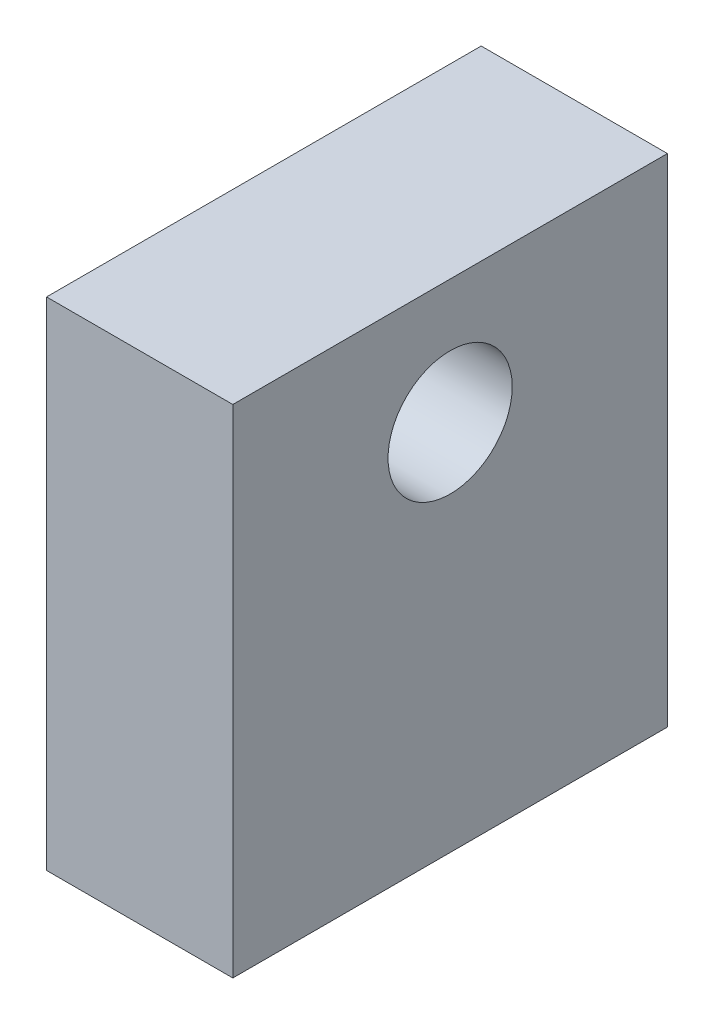
ISO-10303-21;
HEADER;
FILE_DESCRIPTION(('STEP AP214'),'2;1');
FILE_NAME('part.step','',(''),(''),'','','');
FILE_SCHEMA(('AUTOMOTIVE_DESIGN { 1 0 10303 214 1 1 1 1 }'));
ENDSEC;
DATA;
#1=APPLICATION_CONTEXT('core data for automotive mechanical design processes');
#2=APPLICATION_PROTOCOL_DEFINITION('international standard','automotive_design',2000,#1);
#3=PRODUCT_CONTEXT('',#1,'mechanical');
#4=PRODUCT('Part','Part','',(#3));
#5=PRODUCT_RELATED_PRODUCT_CATEGORY('part','',(#4));
#6=PRODUCT_DEFINITION_FORMATION('','',#4);
#7=PRODUCT_DEFINITION_CONTEXT('part definition',#1,'design');
#8=PRODUCT_DEFINITION('design','',#6,#7);
#9=PRODUCT_DEFINITION_SHAPE('','',#8);
#10=(LENGTH_UNIT() NAMED_UNIT(*) SI_UNIT(.MILLI.,.METRE.));
#11=(NAMED_UNIT(*) PLANE_ANGLE_UNIT() SI_UNIT($,.RADIAN.));
#12=(NAMED_UNIT(*) SI_UNIT($,.STERADIAN.) SOLID_ANGLE_UNIT());
#13=UNCERTAINTY_MEASURE_WITH_UNIT(LENGTH_MEASURE(1.E-05),#10,'distance_accuracy_value','');
#14=(GEOMETRIC_REPRESENTATION_CONTEXT(3) GLOBAL_UNCERTAINTY_ASSIGNED_CONTEXT((#13)) GLOBAL_UNIT_ASSIGNED_CONTEXT((#10,
#11,#12)) REPRESENTATION_CONTEXT('',''));
#15=CARTESIAN_POINT('',(0.,0.,0.));
#16=DIRECTION('',(0.,0.,1.));
#17=DIRECTION('',(1.,0.,0.));
#18=AXIS2_PLACEMENT_3D('',#15,#16,#17);
#19=CARTESIAN_POINT('',(0.,101.6,0.));
#20=DIRECTION('',(1.,0.,0.));
#21=DIRECTION('',(0.,0.,-1.));
#22=AXIS2_PLACEMENT_3D('',#19,#20,#21);
#23=PLANE('',#22);
#24=CARTESIAN_POINT('',(0.,76.2,-44.45));
#25=DIRECTION('',(1.,0.,0.));
#26=DIRECTION('',(0.,0.,-1.));
#27=AXIS2_PLACEMENT_3D('',#24,#25,#26);
#28=CIRCLE('',#27,12.7);
#29=CARTESIAN_POINT('',(0.,76.2,-57.15));
#30=VERTEX_POINT('',#29);
#31=EDGE_CURVE('E111',#30,#30,#28,.T.);
#32=ORIENTED_EDGE('',*,*,#31,.T.);
#33=EDGE_LOOP('',(#32));
#34=FACE_BOUND('',#33,.T.);
#35=DIRECTION('',(0.,0.,1.));
#36=VECTOR('',#35,1.);
#37=CARTESIAN_POINT('',(0.,0.,0.));
#38=LINE('',#37,#36);
#39=CARTESIAN_POINT('',(0.,0.,-88.9));
#40=VERTEX_POINT('',#39);
#41=CARTESIAN_POINT('',(0.,0.,0.));
#42=VERTEX_POINT('',#41);
#43=EDGE_CURVE('E107',#40,#42,#38,.T.);
#44=ORIENTED_EDGE('',*,*,#43,.T.);
#45=DIRECTION('',(0.,-1.,0.));
#46=VECTOR('',#45,1.);
#47=CARTESIAN_POINT('',(0.,101.6,0.));
#48=LINE('',#47,#46);
#49=CARTESIAN_POINT('',(0.,101.6,0.));
#50=VERTEX_POINT('',#49);
#51=EDGE_CURVE('E11',#50,#42,#48,.T.);
#52=ORIENTED_EDGE('',*,*,#51,.F.);
#53=DIRECTION('',(0.,0.,1.));
#54=VECTOR('',#53,1.);
#55=CARTESIAN_POINT('',(0.,101.6,0.));
#56=LINE('',#55,#54);
#57=CARTESIAN_POINT('',(0.,101.6,-88.9));
#58=VERTEX_POINT('',#57);
#59=EDGE_CURVE('E91',#58,#50,#56,.T.);
#60=ORIENTED_EDGE('',*,*,#59,.F.);
#61=DIRECTION('',(0.,-1.,0.));
#62=VECTOR('',#61,1.);
#63=CARTESIAN_POINT('',(0.,101.6,-88.9));
#64=LINE('',#63,#62);
#65=EDGE_CURVE('E103',#58,#40,#64,.T.);
#66=ORIENTED_EDGE('',*,*,#65,.T.);
#67=EDGE_LOOP('',(#44,#52,#60,#66));
#68=FACE_BOUND('',#67,.T.);
#69=ADVANCED_FACE('F39',(#34,#68),#23,.F.);
#70=CARTESIAN_POINT('',(0.,101.6,0.));
#71=DIRECTION('',(0.,0.,-1.));
#72=DIRECTION('',(-1.,0.,0.));
#73=AXIS2_PLACEMENT_3D('',#70,#71,#72);
#74=PLANE('',#73);
#75=DIRECTION('',(1.,0.,0.));
#76=VECTOR('',#75,1.);
#77=CARTESIAN_POINT('',(0.,0.,0.));
#78=LINE('',#77,#76);
#79=CARTESIAN_POINT('',(38.1,0.,0.));
#80=VERTEX_POINT('',#79);
#81=EDGE_CURVE('E96',#42,#80,#78,.T.);
#82=ORIENTED_EDGE('',*,*,#81,.T.);
#83=DIRECTION('',(0.,-1.,0.));
#84=VECTOR('',#83,1.);
#85=CARTESIAN_POINT('',(38.1,101.6,0.));
#86=LINE('',#85,#84);
#87=CARTESIAN_POINT('',(38.1,101.6,0.));
#88=VERTEX_POINT('',#87);
#89=EDGE_CURVE('E48',#88,#80,#86,.T.);
#90=ORIENTED_EDGE('',*,*,#89,.F.);
#91=DIRECTION('',(1.,0.,0.));
#92=VECTOR('',#91,1.);
#93=CARTESIAN_POINT('',(0.,101.6,0.));
#94=LINE('',#93,#92);
#95=EDGE_CURVE('E86',#50,#88,#94,.T.);
#96=ORIENTED_EDGE('',*,*,#95,.F.);
#97=ORIENTED_EDGE('',*,*,#51,.T.);
#98=EDGE_LOOP('',(#82,#90,#96,#97));
#99=FACE_BOUND('',#98,.T.);
#100=ADVANCED_FACE('F95',(#99),#74,.F.);
#101=CARTESIAN_POINT('',(38.1,101.6,0.));
#102=DIRECTION('',(-1.,0.,0.));
#103=DIRECTION('',(0.,0.,1.));
#104=AXIS2_PLACEMENT_3D('',#101,#102,#103);
#105=PLANE('',#104);
#106=CARTESIAN_POINT('',(38.1,76.2,-44.45));
#107=DIRECTION('',(1.,0.,0.));
#108=DIRECTION('',(0.,0.,-1.));
#109=AXIS2_PLACEMENT_3D('',#106,#107,#108);
#110=CIRCLE('',#109,12.7);
#111=CARTESIAN_POINT('',(38.1,76.2,-57.15));
#112=VERTEX_POINT('',#111);
#113=EDGE_CURVE('E131',#112,#112,#110,.T.);
#114=ORIENTED_EDGE('',*,*,#113,.F.);
#115=EDGE_LOOP('',(#114));
#116=FACE_BOUND('',#115,.T.);
#117=DIRECTION('',(0.,0.,-1.));
#118=VECTOR('',#117,1.);
#119=CARTESIAN_POINT('',(38.1,0.,0.));
#120=LINE('',#119,#118);
#121=CARTESIAN_POINT('',(38.1,0.,-88.9));
#122=VERTEX_POINT('',#121);
#123=EDGE_CURVE('E73',#80,#122,#120,.T.);
#124=ORIENTED_EDGE('',*,*,#123,.T.);
#125=DIRECTION('',(0.,-1.,0.));
#126=VECTOR('',#125,1.);
#127=CARTESIAN_POINT('',(38.1,101.6,-88.9));
#128=LINE('',#127,#126);
#129=CARTESIAN_POINT('',(38.1,101.6,-88.9));
#130=VERTEX_POINT('',#129);
#131=EDGE_CURVE('E98',#130,#122,#128,.T.);
#132=ORIENTED_EDGE('',*,*,#131,.F.);
#133=DIRECTION('',(0.,0.,-1.));
#134=VECTOR('',#133,1.);
#135=CARTESIAN_POINT('',(38.1,101.6,0.));
#136=LINE('',#135,#134);
#137=EDGE_CURVE('E89',#88,#130,#136,.T.);
#138=ORIENTED_EDGE('',*,*,#137,.F.);
#139=ORIENTED_EDGE('',*,*,#89,.T.);
#140=EDGE_LOOP('',(#124,#132,#138,#139));
#141=FACE_BOUND('',#140,.T.);
#142=ADVANCED_FACE('F99',(#116,#141),#105,.F.);
#143=CARTESIAN_POINT('',(0.,101.6,-88.9));
#144=DIRECTION('',(0.,0.,1.));
#145=DIRECTION('',(1.,0.,0.));
#146=AXIS2_PLACEMENT_3D('',#143,#144,#145);
#147=PLANE('',#146);
#148=DIRECTION('',(-1.,0.,0.));
#149=VECTOR('',#148,1.);
#150=CARTESIAN_POINT('',(0.,0.,-88.9));
#151=LINE('',#150,#149);
#152=EDGE_CURVE('E79',#122,#40,#151,.T.);
#153=ORIENTED_EDGE('',*,*,#152,.T.);
#154=ORIENTED_EDGE('',*,*,#65,.F.);
#155=DIRECTION('',(-1.,0.,0.));
#156=VECTOR('',#155,1.);
#157=CARTESIAN_POINT('',(0.,101.6,-88.9));
#158=LINE('',#157,#156);
#159=EDGE_CURVE('E56',#130,#58,#158,.T.);
#160=ORIENTED_EDGE('',*,*,#159,.F.);
#161=ORIENTED_EDGE('',*,*,#131,.T.);
#162=EDGE_LOOP('',(#153,#154,#160,#161));
#163=FACE_BOUND('',#162,.T.);
#164=ADVANCED_FACE('F121',(#163),#147,.F.);
#165=CARTESIAN_POINT('',(0.,101.6,0.));
#166=DIRECTION('',(0.,-1.,0.));
#167=DIRECTION('',(0.,0.,-1.));
#168=AXIS2_PLACEMENT_3D('',#165,#166,#167);
#169=PLANE('',#168);
#170=ORIENTED_EDGE('',*,*,#59,.T.);
#171=ORIENTED_EDGE('',*,*,#95,.T.);
#172=ORIENTED_EDGE('',*,*,#137,.T.);
#173=ORIENTED_EDGE('',*,*,#159,.T.);
#174=EDGE_LOOP('',(#170,#171,#172,#173));
#175=FACE_BOUND('',#174,.T.);
#176=ADVANCED_FACE('F87',(#175),#169,.F.);
#177=CARTESIAN_POINT('',(0.,0.,0.));
#178=DIRECTION('',(0.,-1.,0.));
#179=DIRECTION('',(0.,0.,-1.));
#180=AXIS2_PLACEMENT_3D('',#177,#178,#179);
#181=PLANE('',#180);
#182=ORIENTED_EDGE('',*,*,#43,.F.);
#183=ORIENTED_EDGE('',*,*,#152,.F.);
#184=ORIENTED_EDGE('',*,*,#123,.F.);
#185=ORIENTED_EDGE('',*,*,#81,.F.);
#186=EDGE_LOOP('',(#182,#183,#184,#185));
#187=FACE_BOUND('',#186,.T.);
#188=ADVANCED_FACE('F124',(#187),#181,.T.);
#189=CARTESIAN_POINT('',(-63.5,76.2,-44.45));
#190=DIRECTION('',(1.,0.,0.));
#191=DIRECTION('',(0.,0.,-1.));
#192=AXIS2_PLACEMENT_3D('',#189,#190,#191);
#193=CYLINDRICAL_SURFACE('',#192,12.7);
#194=ORIENTED_EDGE('',*,*,#113,.T.);
#195=EDGE_LOOP('',(#194));
#196=FACE_BOUND('',#195,.T.);
#197=ORIENTED_EDGE('',*,*,#31,.F.);
#198=EDGE_LOOP('',(#197));
#199=FACE_BOUND('',#198,.T.);
#200=ADVANCED_FACE('F136',(#196,#199),#193,.F.);
#201=CLOSED_SHELL('',(#69,#100,#142,#164,#176,#188,#200));
#202=MANIFOLD_SOLID_BREP('B2',#201);
#203=ADVANCED_BREP_SHAPE_REPRESENTATION('',(#18,#202),#14);
#204=SHAPE_DEFINITION_REPRESENTATION(#9,#203);
ENDSEC;
END-ISO-10303-21;
